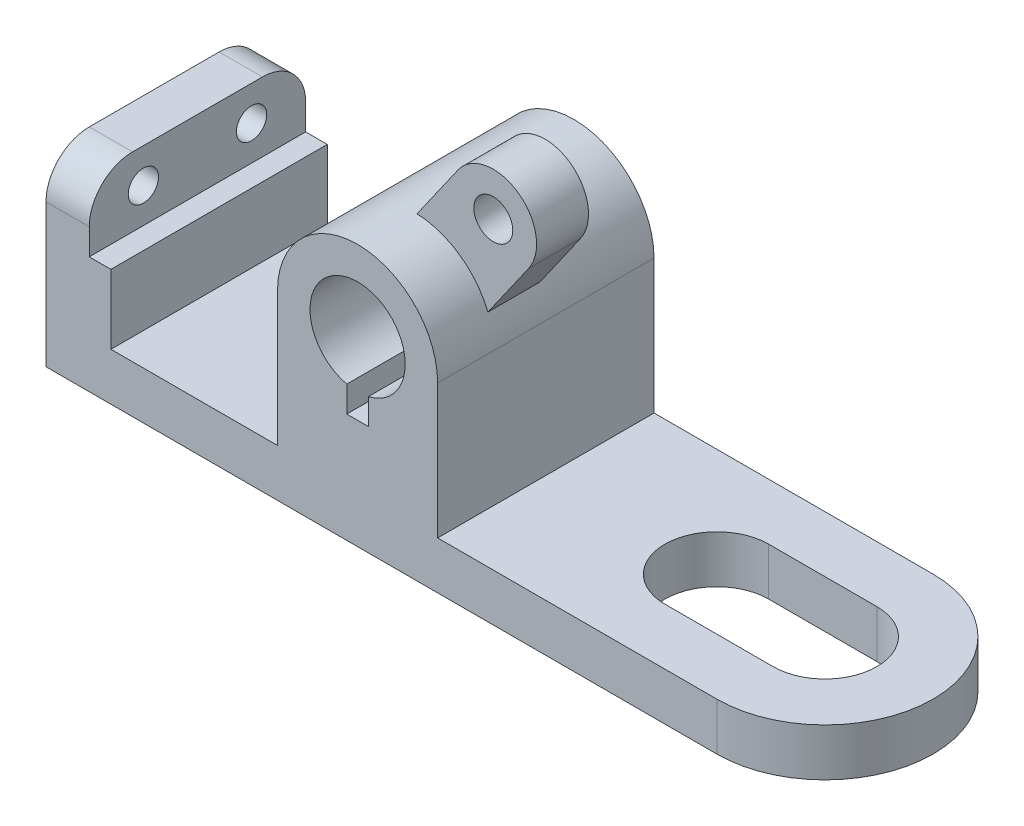
ISO-10303-21;
HEADER;
FILE_DESCRIPTION(('STEP AP214'),'2;1');
FILE_NAME('part.step','',(''),(''),'','','');
FILE_SCHEMA(('AUTOMOTIVE_DESIGN { 1 0 10303 214 1 1 1 1 }'));
ENDSEC;
DATA;
#1=APPLICATION_CONTEXT('core data for automotive mechanical design processes');
#2=APPLICATION_PROTOCOL_DEFINITION('international standard','automotive_design',2000,#1);
#3=PRODUCT_CONTEXT('',#1,'mechanical');
#4=PRODUCT('Part','Part','',(#3));
#5=PRODUCT_RELATED_PRODUCT_CATEGORY('part','',(#4));
#6=PRODUCT_DEFINITION_FORMATION('','',#4);
#7=PRODUCT_DEFINITION_CONTEXT('part definition',#1,'design');
#8=PRODUCT_DEFINITION('design','',#6,#7);
#9=PRODUCT_DEFINITION_SHAPE('','',#8);
#10=(LENGTH_UNIT() NAMED_UNIT(*) SI_UNIT(.MILLI.,.METRE.));
#11=(NAMED_UNIT(*) PLANE_ANGLE_UNIT() SI_UNIT($,.RADIAN.));
#12=(NAMED_UNIT(*) SI_UNIT($,.STERADIAN.) SOLID_ANGLE_UNIT());
#13=UNCERTAINTY_MEASURE_WITH_UNIT(LENGTH_MEASURE(1.E-05),#10,'distance_accuracy_value','');
#14=(GEOMETRIC_REPRESENTATION_CONTEXT(3) GLOBAL_UNCERTAINTY_ASSIGNED_CONTEXT((#13)) GLOBAL_UNIT_ASSIGNED_CONTEXT((#10,
#11,#12)) REPRESENTATION_CONTEXT('',''));
#15=CARTESIAN_POINT('',(0.,0.,0.));
#16=DIRECTION('',(0.,0.,1.));
#17=DIRECTION('',(1.,0.,0.));
#18=AXIS2_PLACEMENT_3D('',#15,#16,#17);
#19=CARTESIAN_POINT('',(0.,0.,-25.));
#20=DIRECTION('',(1.,0.,0.));
#21=DIRECTION('',(0.,0.,-1.));
#22=AXIS2_PLACEMENT_3D('',#19,#20,#21);
#23=PLANE('',#22);
#24=CARTESIAN_POINT('',(0.,33.,15.));
#25=DIRECTION('',(1.,0.,0.));
#26=DIRECTION('',(0.,0.,-1.));
#27=AXIS2_PLACEMENT_3D('',#24,#25,#26);
#28=CIRCLE('',#27,10.);
#29=CARTESIAN_POINT('',(0.,43.,15.));
#30=VERTEX_POINT('',#29);
#31=CARTESIAN_POINT('',(0.,32.9999999999999,25.));
#32=VERTEX_POINT('',#31);
#33=EDGE_CURVE('E297',#30,#32,#28,.T.);
#34=ORIENTED_EDGE('',*,*,#33,.F.);
#35=DIRECTION('',(0.,0.,1.));
#36=VECTOR('',#35,1.);
#37=CARTESIAN_POINT('',(0.,43.,-25.));
#38=LINE('',#37,#36);
#39=CARTESIAN_POINT('',(0.,43.,-14.9999999999999));
#40=VERTEX_POINT('',#39);
#41=EDGE_CURVE('E482',#40,#30,#38,.T.);
#42=ORIENTED_EDGE('',*,*,#41,.F.);
#43=CARTESIAN_POINT('',(0.,33.,-15.));
#44=DIRECTION('',(1.,0.,0.));
#45=DIRECTION('',(0.,0.,-1.));
#46=AXIS2_PLACEMENT_3D('',#43,#44,#45);
#47=CIRCLE('',#46,10.);
#48=CARTESIAN_POINT('',(0.,33.,-25.));
#49=VERTEX_POINT('',#48);
#50=EDGE_CURVE('E301',#40,#49,#47,.F.);
#51=ORIENTED_EDGE('',*,*,#50,.T.);
#52=DIRECTION('',(0.,1.,0.));
#53=VECTOR('',#52,1.);
#54=CARTESIAN_POINT('',(0.,0.,-25.));
#55=LINE('',#54,#53);
#56=CARTESIAN_POINT('',(0.,0.,-25.));
#57=VERTEX_POINT('',#56);
#58=EDGE_CURVE('E460',#57,#49,#55,.T.);
#59=ORIENTED_EDGE('',*,*,#58,.F.);
#60=DIRECTION('',(0.,0.,1.));
#61=VECTOR('',#60,1.);
#62=CARTESIAN_POINT('',(0.,0.,-25.));
#63=LINE('',#62,#61);
#64=CARTESIAN_POINT('',(0.,0.,25.));
#65=VERTEX_POINT('',#64);
#66=EDGE_CURVE('E481',#57,#65,#63,.T.);
#67=ORIENTED_EDGE('',*,*,#66,.T.);
#68=DIRECTION('',(0.,1.,0.));
#69=VECTOR('',#68,1.);
#70=CARTESIAN_POINT('',(0.,0.,25.));
#71=LINE('',#70,#69);
#72=EDGE_CURVE('E406',#65,#32,#71,.T.);
#73=ORIENTED_EDGE('',*,*,#72,.T.);
#74=EDGE_LOOP('',(#34,#42,#51,#59,#67,#73));
#75=FACE_BOUND('',#74,.T.);
#76=CARTESIAN_POINT('',(0.,35.,-12.5));
#77=DIRECTION('',(1.,0.,0.));
#78=DIRECTION('',(0.,0.,-1.));
#79=AXIS2_PLACEMENT_3D('',#76,#77,#78);
#80=CIRCLE('',#79,3.50000000000001);
#81=CARTESIAN_POINT('',(0.,35.,-16.));
#82=VERTEX_POINT('',#81);
#83=EDGE_CURVE('E273',#82,#82,#80,.F.);
#84=ORIENTED_EDGE('',*,*,#83,.F.);
#85=EDGE_LOOP('',(#84));
#86=FACE_BOUND('',#85,.T.);
#87=CARTESIAN_POINT('',(0.,35.,12.5));
#88=DIRECTION('',(1.,0.,0.));
#89=DIRECTION('',(0.,0.,-1.));
#90=AXIS2_PLACEMENT_3D('',#87,#88,#89);
#91=CIRCLE('',#90,3.50000000000001);
#92=CARTESIAN_POINT('',(0.,35.,8.99999999999999));
#93=VERTEX_POINT('',#92);
#94=EDGE_CURVE('E281',#93,#93,#91,.T.);
#95=ORIENTED_EDGE('',*,*,#94,.T.);
#96=EDGE_LOOP('',(#95));
#97=FACE_BOUND('',#96,.T.);
#98=ADVANCED_FACE('F46',(#75,#86,#97),#23,.F.);
#99=CARTESIAN_POINT('',(10.,0.,-25.));
#100=DIRECTION('',(-1.,0.,0.));
#101=DIRECTION('',(0.,-1.,0.));
#102=AXIS2_PLACEMENT_3D('',#99,#100,#101);
#103=PLANE('',#102);
#104=DIRECTION('',(0.,0.,1.));
#105=VECTOR('',#104,1.);
#106=CARTESIAN_POINT('',(10.,43.,-25.));
#107=LINE('',#106,#105);
#108=CARTESIAN_POINT('',(10.,43.,-14.9999999999999));
#109=VERTEX_POINT('',#108);
#110=CARTESIAN_POINT('',(10.,43.,14.9999999999999));
#111=VERTEX_POINT('',#110);
#112=EDGE_CURVE('E488',#109,#111,#107,.T.);
#113=ORIENTED_EDGE('',*,*,#112,.T.);
#114=CARTESIAN_POINT('',(10.,33.,15.));
#115=DIRECTION('',(1.,0.,0.));
#116=DIRECTION('',(0.,1.,0.));
#117=AXIS2_PLACEMENT_3D('',#114,#115,#116);
#118=CIRCLE('',#117,10.);
#119=CARTESIAN_POINT('',(10.,32.9999999999999,25.));
#120=VERTEX_POINT('',#119);
#121=EDGE_CURVE('E288',#111,#120,#118,.T.);
#122=ORIENTED_EDGE('',*,*,#121,.T.);
#123=DIRECTION('',(0.,-1.,0.));
#124=VECTOR('',#123,1.);
#125=CARTESIAN_POINT('',(10.,0.,25.));
#126=LINE('',#125,#124);
#127=CARTESIAN_POINT('',(10.,27.,25.));
#128=VERTEX_POINT('',#127);
#129=EDGE_CURVE('E401',#120,#128,#126,.T.);
#130=ORIENTED_EDGE('',*,*,#129,.T.);
#131=DIRECTION('',(0.,0.,1.));
#132=VECTOR('',#131,1.);
#133=CARTESIAN_POINT('',(10.,27.,-25.));
#134=LINE('',#133,#132);
#135=CARTESIAN_POINT('',(10.,27.,-25.));
#136=VERTEX_POINT('',#135);
#137=EDGE_CURVE('E495',#136,#128,#134,.T.);
#138=ORIENTED_EDGE('',*,*,#137,.F.);
#139=DIRECTION('',(0.,-1.,0.));
#140=VECTOR('',#139,1.);
#141=CARTESIAN_POINT('',(10.,0.,-25.));
#142=LINE('',#141,#140);
#143=CARTESIAN_POINT('',(10.,32.9999999999999,-25.));
#144=VERTEX_POINT('',#143);
#145=EDGE_CURVE('E455',#144,#136,#142,.T.);
#146=ORIENTED_EDGE('',*,*,#145,.F.);
#147=CARTESIAN_POINT('',(10.,33.,-15.));
#148=DIRECTION('',(1.,0.,0.));
#149=DIRECTION('',(0.,1.,0.));
#150=AXIS2_PLACEMENT_3D('',#147,#148,#149);
#151=CIRCLE('',#150,10.);
#152=EDGE_CURVE('E284',#109,#144,#151,.F.);
#153=ORIENTED_EDGE('',*,*,#152,.F.);
#154=EDGE_LOOP('',(#113,#122,#130,#138,#146,#153));
#155=FACE_BOUND('',#154,.T.);
#156=CARTESIAN_POINT('',(10.,35.,-12.5));
#157=DIRECTION('',(1.,0.,0.));
#158=DIRECTION('',(0.,1.,0.));
#159=AXIS2_PLACEMENT_3D('',#156,#157,#158);
#160=CIRCLE('',#159,3.50000000000001);
#161=CARTESIAN_POINT('',(10.,38.5,-12.5));
#162=VERTEX_POINT('',#161);
#163=EDGE_CURVE('E262',#162,#162,#160,.F.);
#164=ORIENTED_EDGE('',*,*,#163,.T.);
#165=EDGE_LOOP('',(#164));
#166=FACE_BOUND('',#165,.T.);
#167=CARTESIAN_POINT('',(10.,35.,12.5));
#168=DIRECTION('',(1.,0.,0.));
#169=DIRECTION('',(0.,1.,0.));
#170=AXIS2_PLACEMENT_3D('',#167,#168,#169);
#171=CIRCLE('',#170,3.50000000000001);
#172=CARTESIAN_POINT('',(10.,38.5,12.5));
#173=VERTEX_POINT('',#172);
#174=EDGE_CURVE('E269',#173,#173,#171,.T.);
#175=ORIENTED_EDGE('',*,*,#174,.F.);
#176=EDGE_LOOP('',(#175));
#177=FACE_BOUND('',#176,.T.);
#178=ADVANCED_FACE('F542',(#155,#166,#177),#103,.F.);
#179=CARTESIAN_POINT('',(0.,43.,-25.));
#180=DIRECTION('',(0.,-1.,0.));
#181=DIRECTION('',(0.,0.,-1.));
#182=AXIS2_PLACEMENT_3D('',#179,#180,#181);
#183=PLANE('',#182);
#184=ORIENTED_EDGE('',*,*,#41,.T.);
#185=DIRECTION('',(1.,0.,0.));
#186=VECTOR('',#185,1.);
#187=CARTESIAN_POINT('',(-0.999999999999997,43.,14.9999999999999));
#188=LINE('',#187,#186);
#189=EDGE_CURVE('E286',#30,#111,#188,.T.);
#190=ORIENTED_EDGE('',*,*,#189,.T.);
#191=ORIENTED_EDGE('',*,*,#112,.F.);
#192=DIRECTION('',(1.,0.,0.));
#193=VECTOR('',#192,1.);
#194=CARTESIAN_POINT('',(-0.999999999999997,43.,-14.9999999999999));
#195=LINE('',#194,#193);
#196=EDGE_CURVE('E292',#40,#109,#195,.T.);
#197=ORIENTED_EDGE('',*,*,#196,.F.);
#198=EDGE_LOOP('',(#184,#190,#191,#197));
#199=FACE_BOUND('',#198,.T.);
#200=ADVANCED_FACE('F552',(#199),#183,.F.);
#201=CARTESIAN_POINT('',(72.,42.,-25.));
#202=DIRECTION('',(0.,0.,1.));
#203=DIRECTION('',(1.,0.,0.));
#204=AXIS2_PLACEMENT_3D('',#201,#202,#203);
#205=CYLINDRICAL_SURFACE('',#204,18.5);
#206=DIRECTION('',(0.,0.,1.));
#207=VECTOR('',#206,1.);
#208=CARTESIAN_POINT('',(53.5,42.,-25.));
#209=LINE('',#208,#207);
#210=CARTESIAN_POINT('',(53.5,42.,-25.));
#211=VERTEX_POINT('',#210);
#212=CARTESIAN_POINT('',(53.5,42.,25.));
#213=VERTEX_POINT('',#212);
#214=EDGE_CURVE('E504',#211,#213,#209,.T.);
#215=ORIENTED_EDGE('',*,*,#214,.T.);
#216=CARTESIAN_POINT('',(72.,42.,25.));
#217=DIRECTION('',(0.,0.,1.));
#218=DIRECTION('',(1.,0.,0.));
#219=AXIS2_PLACEMENT_3D('',#216,#217,#218);
#220=CIRCLE('',#219,18.5);
#221=CARTESIAN_POINT('',(90.5,42.,25.));
#222=VERTEX_POINT('',#221);
#223=EDGE_CURVE('E382',#213,#222,#220,.F.);
#224=ORIENTED_EDGE('',*,*,#223,.T.);
#225=DIRECTION('',(0.,0.,1.));
#226=VECTOR('',#225,1.);
#227=CARTESIAN_POINT('',(90.5,42.,-25.));
#228=LINE('',#227,#226);
#229=CARTESIAN_POINT('',(90.5,42.,-25.));
#230=VERTEX_POINT('',#229);
#231=EDGE_CURVE('E294',#230,#222,#228,.T.);
#232=ORIENTED_EDGE('',*,*,#231,.F.);
#233=CARTESIAN_POINT('',(72.,42.,-25.));
#234=DIRECTION('',(0.,0.,1.));
#235=DIRECTION('',(1.,0.,0.));
#236=AXIS2_PLACEMENT_3D('',#233,#234,#235);
#237=CIRCLE('',#236,18.5);
#238=EDGE_CURVE('E437',#211,#230,#237,.F.);
#239=ORIENTED_EDGE('',*,*,#238,.F.);
#240=EDGE_LOOP('',(#215,#224,#232,#239));
#241=FACE_BOUND('',#240,.T.);
#242=CARTESIAN_POINT('',(72.,42.,12.));
#243=DIRECTION('',(0.,0.,1.));
#244=DIRECTION('',(1.,0.,0.));
#245=AXIS2_PLACEMENT_3D('',#242,#243,#244);
#246=CIRCLE('',#245,18.5);
#247=CARTESIAN_POINT('',(72.7358425574411,60.4853600378964,12.));
#248=VERTEX_POINT('',#247);
#249=CARTESIAN_POINT('',(89.1188834432209,49.0138313108755,12.));
#250=VERTEX_POINT('',#249);
#251=EDGE_CURVE('E329',#248,#250,#246,.F.);
#252=ORIENTED_EDGE('',*,*,#251,.F.);
#253=DIRECTION('',(0.,0.,-1.));
#254=VECTOR('',#253,1.);
#255=CARTESIAN_POINT('',(72.7358425574411,60.4853600378964,12.));
#256=LINE('',#255,#254);
#257=CARTESIAN_POINT('',(72.7358425574411,60.4853600378964,0.));
#258=VERTEX_POINT('',#257);
#259=EDGE_CURVE('E363',#248,#258,#256,.T.);
#260=ORIENTED_EDGE('',*,*,#259,.T.);
#261=CARTESIAN_POINT('',(72.,42.,0.));
#262=DIRECTION('',(0.,0.,1.));
#263=DIRECTION('',(1.,0.,0.));
#264=AXIS2_PLACEMENT_3D('',#261,#262,#263);
#265=CIRCLE('',#264,18.5);
#266=CARTESIAN_POINT('',(89.1188834432209,49.0138313108755,0.));
#267=VERTEX_POINT('',#266);
#268=EDGE_CURVE('E349',#258,#267,#265,.F.);
#269=ORIENTED_EDGE('',*,*,#268,.T.);
#270=DIRECTION('',(0.,0.,-1.));
#271=VECTOR('',#270,1.);
#272=CARTESIAN_POINT('',(89.1188834432209,49.0138313108754,12.));
#273=LINE('',#272,#271);
#274=EDGE_CURVE('E359',#250,#267,#273,.T.);
#275=ORIENTED_EDGE('',*,*,#274,.F.);
#276=EDGE_LOOP('',(#252,#260,#269,#275));
#277=FACE_BOUND('',#276,.T.);
#278=ADVANCED_FACE('F559',(#241,#277),#205,.T.);
#279=CARTESIAN_POINT('',(90.5,0.,-25.));
#280=DIRECTION('',(-1.,0.,0.));
#281=DIRECTION('',(0.,0.,1.));
#282=AXIS2_PLACEMENT_3D('',#279,#280,#281);
#283=PLANE('',#282);
#284=ORIENTED_EDGE('',*,*,#231,.T.);
#285=DIRECTION('',(0.,-1.,0.));
#286=VECTOR('',#285,1.);
#287=CARTESIAN_POINT('',(90.5,0.,25.));
#288=LINE('',#287,#286);
#289=CARTESIAN_POINT('',(90.5,11.,25.));
#290=VERTEX_POINT('',#289);
#291=EDGE_CURVE('E423',#222,#290,#288,.T.);
#292=ORIENTED_EDGE('',*,*,#291,.T.);
#293=DIRECTION('',(0.,0.,1.));
#294=VECTOR('',#293,1.);
#295=CARTESIAN_POINT('',(90.5,11.,-25.));
#296=LINE('',#295,#294);
#297=CARTESIAN_POINT('',(90.5,11.,-25.));
#298=VERTEX_POINT('',#297);
#299=EDGE_CURVE('E476',#298,#290,#296,.T.);
#300=ORIENTED_EDGE('',*,*,#299,.F.);
#301=DIRECTION('',(0.,-1.,0.));
#302=VECTOR('',#301,1.);
#303=CARTESIAN_POINT('',(90.5,0.,-25.));
#304=LINE('',#303,#302);
#305=EDGE_CURVE('E471',#230,#298,#304,.T.);
#306=ORIENTED_EDGE('',*,*,#305,.F.);
#307=EDGE_LOOP('',(#284,#292,#300,#306));
#308=FACE_BOUND('',#307,.T.);
#309=ADVANCED_FACE('F579',(#308),#283,.F.);
#310=CARTESIAN_POINT('',(0.,11.,-25.));
#311=DIRECTION('',(0.,-1.,0.));
#312=DIRECTION('',(0.,0.,-1.));
#313=AXIS2_PLACEMENT_3D('',#310,#311,#312);
#314=PLANE('',#313);
#315=CARTESIAN_POINT('',(130.,11.,0.));
#316=DIRECTION('',(0.,1.,0.));
#317=DIRECTION('',(0.,0.,1.));
#318=AXIS2_PLACEMENT_3D('',#315,#316,#317);
#319=CIRCLE('',#318,12.);
#320=CARTESIAN_POINT('',(130.,11.,-12.));
#321=VERTEX_POINT('',#320);
#322=CARTESIAN_POINT('',(130.,11.,12.));
#323=VERTEX_POINT('',#322);
#324=EDGE_CURVE('E254',#321,#323,#319,.T.);
#325=ORIENTED_EDGE('',*,*,#324,.F.);
#326=DIRECTION('',(-1.,0.,0.));
#327=VECTOR('',#326,1.);
#328=CARTESIAN_POINT('',(0.,11.,-12.));
#329=LINE('',#328,#327);
#330=CARTESIAN_POINT('',(155.,11.,-12.));
#331=VERTEX_POINT('',#330);
#332=EDGE_CURVE('E63',#331,#321,#329,.T.);
#333=ORIENTED_EDGE('',*,*,#332,.F.);
#334=CARTESIAN_POINT('',(155.,11.,0.));
#335=DIRECTION('',(0.,1.,0.));
#336=DIRECTION('',(0.,0.,1.));
#337=AXIS2_PLACEMENT_3D('',#334,#335,#336);
#338=CIRCLE('',#337,12.);
#339=CARTESIAN_POINT('',(155.,11.,12.));
#340=VERTEX_POINT('',#339);
#341=EDGE_CURVE('E245',#340,#331,#338,.T.);
#342=ORIENTED_EDGE('',*,*,#341,.F.);
#343=DIRECTION('',(-1.,0.,0.));
#344=VECTOR('',#343,1.);
#345=CARTESIAN_POINT('',(0.,11.,12.));
#346=LINE('',#345,#344);
#347=EDGE_CURVE('E248',#340,#323,#346,.T.);
#348=ORIENTED_EDGE('',*,*,#347,.T.);
#349=EDGE_LOOP('',(#325,#333,#342,#348));
#350=FACE_BOUND('',#349,.T.);
#351=ORIENTED_EDGE('',*,*,#299,.T.);
#352=DIRECTION('',(1.,0.,0.));
#353=VECTOR('',#352,1.);
#354=CARTESIAN_POINT('',(0.,11.,25.));
#355=LINE('',#354,#353);
#356=CARTESIAN_POINT('',(155.,11.,25.));
#357=VERTEX_POINT('',#356);
#358=EDGE_CURVE('E417',#290,#357,#355,.T.);
#359=ORIENTED_EDGE('',*,*,#358,.T.);
#360=CARTESIAN_POINT('',(155.,11.,0.));
#361=DIRECTION('',(0.,1.,0.));
#362=DIRECTION('',(0.,0.,-1.));
#363=AXIS2_PLACEMENT_3D('',#360,#361,#362);
#364=CIRCLE('',#363,25.);
#365=CARTESIAN_POINT('',(155.,11.,-25.));
#366=VERTEX_POINT('',#365);
#367=EDGE_CURVE('E310',#357,#366,#364,.T.);
#368=ORIENTED_EDGE('',*,*,#367,.T.);
#369=DIRECTION('',(1.,0.,0.));
#370=VECTOR('',#369,1.);
#371=CARTESIAN_POINT('',(0.,11.,-25.));
#372=LINE('',#371,#370);
#373=EDGE_CURVE('E470',#298,#366,#372,.T.);
#374=ORIENTED_EDGE('',*,*,#373,.F.);
#375=EDGE_LOOP('',(#351,#359,#368,#374));
#376=FACE_BOUND('',#375,.T.);
#377=ADVANCED_FACE('F624',(#350,#376),#314,.F.);
#378=CARTESIAN_POINT('',(0.,0.,-25.));
#379=DIRECTION('',(0.,-1.,0.));
#380=DIRECTION('',(0.,0.,-1.));
#381=AXIS2_PLACEMENT_3D('',#378,#379,#380);
#382=PLANE('',#381);
#383=DIRECTION('',(-1.,0.,0.));
#384=VECTOR('',#383,1.);
#385=CARTESIAN_POINT('',(0.,0.,-12.));
#386=LINE('',#385,#384);
#387=CARTESIAN_POINT('',(155.,0.,-12.));
#388=VERTEX_POINT('',#387);
#389=CARTESIAN_POINT('',(130.,0.,-12.));
#390=VERTEX_POINT('',#389);
#391=EDGE_CURVE('E221',#388,#390,#386,.T.);
#392=ORIENTED_EDGE('',*,*,#391,.T.);
#393=CARTESIAN_POINT('',(130.,0.,0.));
#394=DIRECTION('',(0.,1.,0.));
#395=DIRECTION('',(0.,0.,1.));
#396=AXIS2_PLACEMENT_3D('',#393,#394,#395);
#397=CIRCLE('',#396,12.);
#398=CARTESIAN_POINT('',(130.,0.,12.));
#399=VERTEX_POINT('',#398);
#400=EDGE_CURVE('E233',#390,#399,#397,.T.);
#401=ORIENTED_EDGE('',*,*,#400,.T.);
#402=DIRECTION('',(-1.,0.,0.));
#403=VECTOR('',#402,1.);
#404=CARTESIAN_POINT('',(0.,0.,12.));
#405=LINE('',#404,#403);
#406=CARTESIAN_POINT('',(155.,0.,12.));
#407=VERTEX_POINT('',#406);
#408=EDGE_CURVE('E237',#407,#399,#405,.T.);
#409=ORIENTED_EDGE('',*,*,#408,.F.);
#410=CARTESIAN_POINT('',(155.,0.,0.));
#411=DIRECTION('',(0.,1.,0.));
#412=DIRECTION('',(0.,0.,1.));
#413=AXIS2_PLACEMENT_3D('',#410,#411,#412);
#414=CIRCLE('',#413,12.);
#415=EDGE_CURVE('E227',#407,#388,#414,.T.);
#416=ORIENTED_EDGE('',*,*,#415,.T.);
#417=EDGE_LOOP('',(#392,#401,#409,#416));
#418=FACE_BOUND('',#417,.T.);
#419=DIRECTION('',(1.,0.,0.));
#420=VECTOR('',#419,1.);
#421=CARTESIAN_POINT('',(0.,0.,-25.));
#422=LINE('',#421,#420);
#423=CARTESIAN_POINT('',(155.,0.,-25.));
#424=VERTEX_POINT('',#423);
#425=EDGE_CURVE('E461',#57,#424,#422,.T.);
#426=ORIENTED_EDGE('',*,*,#425,.T.);
#427=CARTESIAN_POINT('',(155.,0.,0.));
#428=DIRECTION('',(0.,1.,0.));
#429=DIRECTION('',(0.,0.,-1.));
#430=AXIS2_PLACEMENT_3D('',#427,#428,#429);
#431=CIRCLE('',#430,25.);
#432=CARTESIAN_POINT('',(155.,0.,25.));
#433=VERTEX_POINT('',#432);
#434=EDGE_CURVE('E309',#433,#424,#431,.T.);
#435=ORIENTED_EDGE('',*,*,#434,.F.);
#436=DIRECTION('',(1.,0.,0.));
#437=VECTOR('',#436,1.);
#438=CARTESIAN_POINT('',(0.,0.,25.));
#439=LINE('',#438,#437);
#440=EDGE_CURVE('E409',#65,#433,#439,.T.);
#441=ORIENTED_EDGE('',*,*,#440,.F.);
#442=ORIENTED_EDGE('',*,*,#66,.F.);
#443=EDGE_LOOP('',(#426,#435,#441,#442));
#444=FACE_BOUND('',#443,.T.);
#445=ADVANCED_FACE('F236',(#418,#444),#382,.T.);
#446=CARTESIAN_POINT('',(0.,27.,-25.));
#447=DIRECTION('',(0.,-1.,0.));
#448=DIRECTION('',(1.,0.,0.));
#449=AXIS2_PLACEMENT_3D('',#446,#447,#448);
#450=PLANE('',#449);
#451=ORIENTED_EDGE('',*,*,#137,.T.);
#452=DIRECTION('',(1.,0.,0.));
#453=VECTOR('',#452,1.);
#454=CARTESIAN_POINT('',(0.,27.,25.));
#455=LINE('',#454,#453);
#456=CARTESIAN_POINT('',(15.,27.,25.));
#457=VERTEX_POINT('',#456);
#458=EDGE_CURVE('E400',#128,#457,#455,.T.);
#459=ORIENTED_EDGE('',*,*,#458,.T.);
#460=DIRECTION('',(0.,0.,1.));
#461=VECTOR('',#460,1.);
#462=CARTESIAN_POINT('',(15.,27.,-25.));
#463=LINE('',#462,#461);
#464=CARTESIAN_POINT('',(15.,27.,-25.));
#465=VERTEX_POINT('',#464);
#466=EDGE_CURVE('E497',#465,#457,#463,.T.);
#467=ORIENTED_EDGE('',*,*,#466,.F.);
#468=DIRECTION('',(1.,0.,0.));
#469=VECTOR('',#468,1.);
#470=CARTESIAN_POINT('',(0.,27.,-25.));
#471=LINE('',#470,#469);
#472=EDGE_CURVE('E453',#136,#465,#471,.T.);
#473=ORIENTED_EDGE('',*,*,#472,.F.);
#474=EDGE_LOOP('',(#451,#459,#467,#473));
#475=FACE_BOUND('',#474,.T.);
#476=ADVANCED_FACE('F562',(#475),#450,.F.);
#477=CARTESIAN_POINT('',(15.,0.,-25.));
#478=DIRECTION('',(-1.,0.,0.));
#479=DIRECTION('',(0.,0.,1.));
#480=AXIS2_PLACEMENT_3D('',#477,#478,#479);
#481=PLANE('',#480);
#482=ORIENTED_EDGE('',*,*,#466,.T.);
#483=DIRECTION('',(0.,-1.,0.));
#484=VECTOR('',#483,1.);
#485=CARTESIAN_POINT('',(15.,0.,25.));
#486=LINE('',#485,#484);
#487=CARTESIAN_POINT('',(15.,11.,25.));
#488=VERTEX_POINT('',#487);
#489=EDGE_CURVE('E394',#457,#488,#486,.T.);
#490=ORIENTED_EDGE('',*,*,#489,.T.);
#491=DIRECTION('',(0.,0.,1.));
#492=VECTOR('',#491,1.);
#493=CARTESIAN_POINT('',(15.,11.,-25.));
#494=LINE('',#493,#492);
#495=CARTESIAN_POINT('',(15.,11.,-25.));
#496=VERTEX_POINT('',#495);
#497=EDGE_CURVE('E496',#496,#488,#494,.T.);
#498=ORIENTED_EDGE('',*,*,#497,.F.);
#499=DIRECTION('',(0.,-1.,0.));
#500=VECTOR('',#499,1.);
#501=CARTESIAN_POINT('',(15.,0.,-25.));
#502=LINE('',#501,#500);
#503=EDGE_CURVE('E447',#465,#496,#502,.T.);
#504=ORIENTED_EDGE('',*,*,#503,.F.);
#505=EDGE_LOOP('',(#482,#490,#498,#504));
#506=FACE_BOUND('',#505,.T.);
#507=ADVANCED_FACE('F567',(#506),#481,.F.);
#508=CARTESIAN_POINT('',(0.,11.,-25.));
#509=DIRECTION('',(0.,-1.,0.));
#510=DIRECTION('',(0.,0.,-1.));
#511=AXIS2_PLACEMENT_3D('',#508,#509,#510);
#512=PLANE('',#511);
#513=ORIENTED_EDGE('',*,*,#497,.T.);
#514=DIRECTION('',(1.,0.,0.));
#515=VECTOR('',#514,1.);
#516=CARTESIAN_POINT('',(0.,11.,25.));
#517=LINE('',#516,#515);
#518=CARTESIAN_POINT('',(53.5,11.,25.));
#519=VERTEX_POINT('',#518);
#520=EDGE_CURVE('E391',#488,#519,#517,.T.);
#521=ORIENTED_EDGE('',*,*,#520,.T.);
#522=DIRECTION('',(0.,0.,1.));
#523=VECTOR('',#522,1.);
#524=CARTESIAN_POINT('',(53.5,11.,-25.));
#525=LINE('',#524,#523);
#526=CARTESIAN_POINT('',(53.5,11.,-25.));
#527=VERTEX_POINT('',#526);
#528=EDGE_CURVE('E505',#527,#519,#525,.T.);
#529=ORIENTED_EDGE('',*,*,#528,.F.);
#530=DIRECTION('',(1.,0.,0.));
#531=VECTOR('',#530,1.);
#532=CARTESIAN_POINT('',(0.,11.,-25.));
#533=LINE('',#532,#531);
#534=EDGE_CURVE('E443',#496,#527,#533,.T.);
#535=ORIENTED_EDGE('',*,*,#534,.F.);
#536=EDGE_LOOP('',(#513,#521,#529,#535));
#537=FACE_BOUND('',#536,.T.);
#538=ADVANCED_FACE('F568',(#537),#512,.F.);
#539=CARTESIAN_POINT('',(72.,42.,-25.));
#540=DIRECTION('',(0.,0.,1.));
#541=DIRECTION('',(1.,0.,0.));
#542=AXIS2_PLACEMENT_3D('',#539,#540,#541);
#543=CYLINDRICAL_SURFACE('',#542,11.);
#544=DIRECTION('',(0.,0.,1.));
#545=VECTOR('',#544,1.);
#546=CARTESIAN_POINT('',(74.5,31.2878573571857,-25.));
#547=LINE('',#546,#545);
#548=CARTESIAN_POINT('',(74.5,31.2878573571857,-25.));
#549=VERTEX_POINT('',#548);
#550=CARTESIAN_POINT('',(74.5,31.2878573571857,25.));
#551=VERTEX_POINT('',#550);
#552=EDGE_CURVE('E49',#549,#551,#547,.T.);
#553=ORIENTED_EDGE('',*,*,#552,.T.);
#554=CARTESIAN_POINT('',(72.,42.,25.));
#555=DIRECTION('',(0.,0.,1.));
#556=DIRECTION('',(1.,0.,0.));
#557=AXIS2_PLACEMENT_3D('',#554,#555,#556);
#558=CIRCLE('',#557,11.);
#559=CARTESIAN_POINT('',(69.5,31.2878573571857,25.));
#560=VERTEX_POINT('',#559);
#561=EDGE_CURVE('E370',#551,#560,#558,.T.);
#562=ORIENTED_EDGE('',*,*,#561,.T.);
#563=DIRECTION('',(0.,0.,1.));
#564=VECTOR('',#563,1.);
#565=CARTESIAN_POINT('',(69.5,31.2878573571857,-25.));
#566=LINE('',#565,#564);
#567=CARTESIAN_POINT('',(69.5,31.2878573571857,-25.));
#568=VERTEX_POINT('',#567);
#569=EDGE_CURVE('E507',#568,#560,#566,.T.);
#570=ORIENTED_EDGE('',*,*,#569,.F.);
#571=CARTESIAN_POINT('',(72.,42.,-25.));
#572=DIRECTION('',(0.,0.,1.));
#573=DIRECTION('',(1.,0.,0.));
#574=AXIS2_PLACEMENT_3D('',#571,#572,#573);
#575=CIRCLE('',#574,11.);
#576=EDGE_CURVE('E422',#549,#568,#575,.T.);
#577=ORIENTED_EDGE('',*,*,#576,.F.);
#578=EDGE_LOOP('',(#553,#562,#570,#577));
#579=FACE_BOUND('',#578,.T.);
#580=ADVANCED_FACE('F48',(#579),#543,.F.);
#581=CARTESIAN_POINT('',(69.5,0.,-25.));
#582=DIRECTION('',(-1.,0.,0.));
#583=DIRECTION('',(0.,0.,1.));
#584=AXIS2_PLACEMENT_3D('',#581,#582,#583);
#585=PLANE('',#584);
#586=ORIENTED_EDGE('',*,*,#569,.T.);
#587=DIRECTION('',(0.,-1.,0.));
#588=VECTOR('',#587,1.);
#589=CARTESIAN_POINT('',(69.5,0.,25.));
#590=LINE('',#589,#588);
#591=CARTESIAN_POINT('',(69.5,25.2878573571857,25.));
#592=VERTEX_POINT('',#591);
#593=EDGE_CURVE('E377',#560,#592,#590,.T.);
#594=ORIENTED_EDGE('',*,*,#593,.T.);
#595=DIRECTION('',(0.,0.,1.));
#596=VECTOR('',#595,1.);
#597=CARTESIAN_POINT('',(69.5,25.2878573571857,-25.));
#598=LINE('',#597,#596);
#599=CARTESIAN_POINT('',(69.5,25.2878573571857,-25.));
#600=VERTEX_POINT('',#599);
#601=EDGE_CURVE('E512',#600,#592,#598,.T.);
#602=ORIENTED_EDGE('',*,*,#601,.F.);
#603=DIRECTION('',(0.,-1.,0.));
#604=VECTOR('',#603,1.);
#605=CARTESIAN_POINT('',(69.5,0.,-25.));
#606=LINE('',#605,#604);
#607=EDGE_CURVE('E434',#568,#600,#606,.T.);
#608=ORIENTED_EDGE('',*,*,#607,.F.);
#609=EDGE_LOOP('',(#586,#594,#602,#608));
#610=FACE_BOUND('',#609,.T.);
#611=ADVANCED_FACE('F539',(#610),#585,.F.);
#612=CARTESIAN_POINT('',(0.,25.2878573571857,-25.));
#613=DIRECTION('',(0.,-1.,0.));
#614=DIRECTION('',(0.,0.,-1.));
#615=AXIS2_PLACEMENT_3D('',#612,#613,#614);
#616=PLANE('',#615);
#617=ORIENTED_EDGE('',*,*,#601,.T.);
#618=DIRECTION('',(1.,0.,0.));
#619=VECTOR('',#618,1.);
#620=CARTESIAN_POINT('',(0.,25.2878573571857,25.));
#621=LINE('',#620,#619);
#622=CARTESIAN_POINT('',(74.5,25.2878573571857,25.));
#623=VERTEX_POINT('',#622);
#624=EDGE_CURVE('E374',#592,#623,#621,.T.);
#625=ORIENTED_EDGE('',*,*,#624,.T.);
#626=DIRECTION('',(0.,0.,1.));
#627=VECTOR('',#626,1.);
#628=CARTESIAN_POINT('',(74.5,25.2878573571857,-25.));
#629=LINE('',#628,#627);
#630=CARTESIAN_POINT('',(74.5,25.2878573571857,-25.));
#631=VERTEX_POINT('',#630);
#632=EDGE_CURVE('E511',#631,#623,#629,.T.);
#633=ORIENTED_EDGE('',*,*,#632,.F.);
#634=DIRECTION('',(1.,0.,0.));
#635=VECTOR('',#634,1.);
#636=CARTESIAN_POINT('',(0.,25.2878573571857,-25.));
#637=LINE('',#636,#635);
#638=EDGE_CURVE('E435',#600,#631,#637,.T.);
#639=ORIENTED_EDGE('',*,*,#638,.F.);
#640=EDGE_LOOP('',(#617,#625,#633,#639));
#641=FACE_BOUND('',#640,.T.);
#642=ADVANCED_FACE('F535',(#641),#616,.F.);
#643=CARTESIAN_POINT('',(74.5,0.,-25.));
#644=DIRECTION('',(1.,0.,0.));
#645=DIRECTION('',(0.,0.,-1.));
#646=AXIS2_PLACEMENT_3D('',#643,#644,#645);
#647=PLANE('',#646);
#648=ORIENTED_EDGE('',*,*,#632,.T.);
#649=DIRECTION('',(0.,1.,0.));
#650=VECTOR('',#649,1.);
#651=CARTESIAN_POINT('',(74.5,0.,25.));
#652=LINE('',#651,#650);
#653=EDGE_CURVE('E371',#623,#551,#652,.T.);
#654=ORIENTED_EDGE('',*,*,#653,.T.);
#655=ORIENTED_EDGE('',*,*,#552,.F.);
#656=DIRECTION('',(0.,1.,0.));
#657=VECTOR('',#656,1.);
#658=CARTESIAN_POINT('',(74.5,0.,-25.));
#659=LINE('',#658,#657);
#660=EDGE_CURVE('E427',#631,#549,#659,.T.);
#661=ORIENTED_EDGE('',*,*,#660,.F.);
#662=EDGE_LOOP('',(#648,#654,#655,#661));
#663=FACE_BOUND('',#662,.T.);
#664=ADVANCED_FACE('F530',(#663),#647,.F.);
#665=CARTESIAN_POINT('',(53.5,0.,-25.));
#666=DIRECTION('',(1.,0.,0.));
#667=DIRECTION('',(0.,0.,-1.));
#668=AXIS2_PLACEMENT_3D('',#665,#666,#667);
#669=PLANE('',#668);
#670=ORIENTED_EDGE('',*,*,#528,.T.);
#671=DIRECTION('',(0.,1.,0.));
#672=VECTOR('',#671,1.);
#673=CARTESIAN_POINT('',(53.5,0.,25.));
#674=LINE('',#673,#672);
#675=EDGE_CURVE('E390',#519,#213,#674,.T.);
#676=ORIENTED_EDGE('',*,*,#675,.T.);
#677=ORIENTED_EDGE('',*,*,#214,.F.);
#678=DIRECTION('',(0.,1.,0.));
#679=VECTOR('',#678,1.);
#680=CARTESIAN_POINT('',(53.5,0.,-25.));
#681=LINE('',#680,#679);
#682=EDGE_CURVE('E445',#527,#211,#681,.T.);
#683=ORIENTED_EDGE('',*,*,#682,.F.);
#684=EDGE_LOOP('',(#670,#676,#677,#683));
#685=FACE_BOUND('',#684,.T.);
#686=ADVANCED_FACE('F533',(#685),#669,.F.);
#687=CARTESIAN_POINT('',(0.,0.,-25.));
#688=DIRECTION('',(0.,0.,1.));
#689=DIRECTION('',(1.,0.,0.));
#690=AXIS2_PLACEMENT_3D('',#687,#688,#689);
#691=PLANE('',#690);
#692=ORIENTED_EDGE('',*,*,#576,.T.);
#693=ORIENTED_EDGE('',*,*,#607,.T.);
#694=ORIENTED_EDGE('',*,*,#638,.T.);
#695=ORIENTED_EDGE('',*,*,#660,.T.);
#696=EDGE_LOOP('',(#692,#693,#694,#695));
#697=FACE_BOUND('',#696,.T.);
#698=ORIENTED_EDGE('',*,*,#58,.T.);
#699=DIRECTION('',(1.,0.,0.));
#700=VECTOR('',#699,1.);
#701=CARTESIAN_POINT('',(-0.999999999999996,32.9999999999999,-25.));
#702=LINE('',#701,#700);
#703=EDGE_CURVE('E12',#49,#144,#702,.T.);
#704=ORIENTED_EDGE('',*,*,#703,.T.);
#705=ORIENTED_EDGE('',*,*,#145,.T.);
#706=ORIENTED_EDGE('',*,*,#472,.T.);
#707=ORIENTED_EDGE('',*,*,#503,.T.);
#708=ORIENTED_EDGE('',*,*,#534,.T.);
#709=ORIENTED_EDGE('',*,*,#682,.T.);
#710=ORIENTED_EDGE('',*,*,#238,.T.);
#711=ORIENTED_EDGE('',*,*,#305,.T.);
#712=ORIENTED_EDGE('',*,*,#373,.T.);
#713=DIRECTION('',(0.,-1.,0.));
#714=VECTOR('',#713,1.);
#715=CARTESIAN_POINT('',(155.,0.,-25.));
#716=LINE('',#715,#714);
#717=EDGE_CURVE('E464',#366,#424,#716,.T.);
#718=ORIENTED_EDGE('',*,*,#717,.T.);
#719=ORIENTED_EDGE('',*,*,#425,.F.);
#720=EDGE_LOOP('',(#698,#704,#705,#706,#707,#708,#709,#710,#711,#712,#718,#719));
#721=FACE_BOUND('',#720,.T.);
#722=ADVANCED_FACE('F540',(#697,#721),#691,.F.);
#723=CARTESIAN_POINT('',(0.,0.,25.));
#724=DIRECTION('',(0.,0.,1.));
#725=DIRECTION('',(1.,0.,0.));
#726=AXIS2_PLACEMENT_3D('',#723,#724,#725);
#727=PLANE('',#726);
#728=DIRECTION('',(1.,0.,0.));
#729=VECTOR('',#728,1.);
#730=CARTESIAN_POINT('',(-0.999999999999996,32.9999999999999,25.));
#731=LINE('',#730,#729);
#732=EDGE_CURVE('E57',#32,#120,#731,.T.);
#733=ORIENTED_EDGE('',*,*,#732,.F.);
#734=ORIENTED_EDGE('',*,*,#72,.F.);
#735=ORIENTED_EDGE('',*,*,#440,.T.);
#736=DIRECTION('',(0.,-1.,0.));
#737=VECTOR('',#736,1.);
#738=CARTESIAN_POINT('',(155.,0.,25.));
#739=LINE('',#738,#737);
#740=EDGE_CURVE('E415',#357,#433,#739,.T.);
#741=ORIENTED_EDGE('',*,*,#740,.F.);
#742=ORIENTED_EDGE('',*,*,#358,.F.);
#743=ORIENTED_EDGE('',*,*,#291,.F.);
#744=ORIENTED_EDGE('',*,*,#223,.F.);
#745=ORIENTED_EDGE('',*,*,#675,.F.);
#746=ORIENTED_EDGE('',*,*,#520,.F.);
#747=ORIENTED_EDGE('',*,*,#489,.F.);
#748=ORIENTED_EDGE('',*,*,#458,.F.);
#749=ORIENTED_EDGE('',*,*,#129,.F.);
#750=EDGE_LOOP('',(#733,#734,#735,#741,#742,#743,#744,#745,#746,#747,#748,#749));
#751=FACE_BOUND('',#750,.T.);
#752=ORIENTED_EDGE('',*,*,#561,.F.);
#753=ORIENTED_EDGE('',*,*,#653,.F.);
#754=ORIENTED_EDGE('',*,*,#624,.F.);
#755=ORIENTED_EDGE('',*,*,#593,.F.);
#756=EDGE_LOOP('',(#752,#753,#754,#755));
#757=FACE_BOUND('',#756,.T.);
#758=ADVANCED_FACE('F527',(#751,#757),#727,.T.);
#759=CARTESIAN_POINT('',(90.3544459632336,68.2128654172477,12.));
#760=DIRECTION('',(0.,0.,-1.));
#761=DIRECTION('',(-1.,0.,0.));
#762=AXIS2_PLACEMENT_3D('',#759,#760,#761);
#763=CYLINDRICAL_SURFACE('',#762,10.);
#764=CARTESIAN_POINT('',(90.3544459632336,68.2128654172477,0.));
#765=DIRECTION('',(0.,0.,1.));
#766=DIRECTION('',(1.,0.,0.));
#767=AXIS2_PLACEMENT_3D('',#764,#765,#766);
#768=CIRCLE('',#767,10.);
#769=CARTESIAN_POINT('',(82.1629255203437,73.9486297807582,0.));
#770=VERTEX_POINT('',#769);
#771=CARTESIAN_POINT('',(98.5459664061235,62.4771010537372,0.));
#772=VERTEX_POINT('',#771);
#773=EDGE_CURVE('E343',#770,#772,#768,.F.);
#774=ORIENTED_EDGE('',*,*,#773,.F.);
#775=DIRECTION('',(0.,0.,-1.));
#776=VECTOR('',#775,1.);
#777=CARTESIAN_POINT('',(82.1629255203437,73.9486297807582,12.));
#778=LINE('',#777,#776);
#779=CARTESIAN_POINT('',(82.1629255203437,73.9486297807582,12.));
#780=VERTEX_POINT('',#779);
#781=EDGE_CURVE('E365',#780,#770,#778,.T.);
#782=ORIENTED_EDGE('',*,*,#781,.F.);
#783=CARTESIAN_POINT('',(90.3544459632336,68.2128654172477,12.));
#784=DIRECTION('',(0.,0.,1.));
#785=DIRECTION('',(1.,0.,0.));
#786=AXIS2_PLACEMENT_3D('',#783,#784,#785);
#787=CIRCLE('',#786,10.);
#788=CARTESIAN_POINT('',(98.5459664061235,62.4771010537372,12.));
#789=VERTEX_POINT('',#788);
#790=EDGE_CURVE('E321',#780,#789,#787,.F.);
#791=ORIENTED_EDGE('',*,*,#790,.T.);
#792=DIRECTION('',(0.,0.,-1.));
#793=VECTOR('',#792,1.);
#794=CARTESIAN_POINT('',(98.5459664061235,62.4771010537372,12.));
#795=LINE('',#794,#793);
#796=EDGE_CURVE('E340',#789,#772,#795,.T.);
#797=ORIENTED_EDGE('',*,*,#796,.T.);
#798=EDGE_LOOP('',(#774,#782,#791,#797));
#799=FACE_BOUND('',#798,.T.);
#800=ADVANCED_FACE('F650',(#799),#763,.T.);
#801=CARTESIAN_POINT('',(20.3876596803297,-14.2755929946212,12.));
#802=DIRECTION('',(-0.819152044288989,0.57357643635105,0.));
#803=DIRECTION('',(-0.57357643635105,-0.819152044288989,0.));
#804=AXIS2_PLACEMENT_3D('',#801,#802,#803);
#805=PLANE('',#804);
#806=DIRECTION('',(0.57357643635105,0.819152044288989,0.));
#807=VECTOR('',#806,1.);
#808=CARTESIAN_POINT('',(20.3876596803297,-14.2755929946212,0.));
#809=LINE('',#808,#807);
#810=EDGE_CURVE('E341',#258,#770,#809,.T.);
#811=ORIENTED_EDGE('',*,*,#810,.F.);
#812=ORIENTED_EDGE('',*,*,#259,.F.);
#813=DIRECTION('',(0.57357643635105,0.819152044288989,0.));
#814=VECTOR('',#813,1.);
#815=CARTESIAN_POINT('',(20.3876596803297,-14.2755929946212,12.));
#816=LINE('',#815,#814);
#817=EDGE_CURVE('E326',#248,#780,#816,.T.);
#818=ORIENTED_EDGE('',*,*,#817,.T.);
#819=ORIENTED_EDGE('',*,*,#781,.T.);
#820=EDGE_LOOP('',(#811,#812,#818,#819));
#821=FACE_BOUND('',#820,.T.);
#822=ADVANCED_FACE('F655',(#821),#805,.T.);
#823=CARTESIAN_POINT('',(90.3544459632336,68.2128654172477,12.));
#824=DIRECTION('',(0.,0.,-1.));
#825=DIRECTION('',(-1.,0.,0.));
#826=AXIS2_PLACEMENT_3D('',#823,#824,#825);
#827=CYLINDRICAL_SURFACE('',#826,4.50000000000001);
#828=CARTESIAN_POINT('',(90.3544459632336,68.2128654172477,12.));
#829=DIRECTION('',(0.,0.,1.));
#830=DIRECTION('',(1.,0.,0.));
#831=AXIS2_PLACEMENT_3D('',#828,#829,#830);
#832=CIRCLE('',#831,4.50000000000001);
#833=CARTESIAN_POINT('',(94.8544459632336,68.2128654172477,12.));
#834=VERTEX_POINT('',#833);
#835=EDGE_CURVE('E320',#834,#834,#832,.T.);
#836=ORIENTED_EDGE('',*,*,#835,.T.);
#837=EDGE_LOOP('',(#836));
#838=FACE_BOUND('',#837,.T.);
#839=CARTESIAN_POINT('',(90.3544459632336,68.2128654172477,0.));
#840=DIRECTION('',(0.,0.,1.));
#841=DIRECTION('',(1.,0.,0.));
#842=AXIS2_PLACEMENT_3D('',#839,#840,#841);
#843=CIRCLE('',#842,4.50000000000001);
#844=CARTESIAN_POINT('',(94.8544459632336,68.2128654172477,0.));
#845=VERTEX_POINT('',#844);
#846=EDGE_CURVE('E311',#845,#845,#843,.T.);
#847=ORIENTED_EDGE('',*,*,#846,.F.);
#848=EDGE_LOOP('',(#847));
#849=FACE_BOUND('',#848,.T.);
#850=ADVANCED_FACE('F648',(#838,#849),#827,.F.);
#851=CARTESIAN_POINT('',(36.7707005661095,-25.7471217216422,12.));
#852=DIRECTION('',(-0.819152044288989,0.57357643635105,0.));
#853=DIRECTION('',(-0.57357643635105,-0.819152044288989,0.));
#854=AXIS2_PLACEMENT_3D('',#851,#852,#853);
#855=PLANE('',#854);
#856=DIRECTION('',(0.57357643635105,0.819152044288989,0.));
#857=VECTOR('',#856,1.);
#858=CARTESIAN_POINT('',(36.7707005661095,-25.7471217216422,0.));
#859=LINE('',#858,#857);
#860=EDGE_CURVE('E325',#267,#772,#859,.T.);
#861=ORIENTED_EDGE('',*,*,#860,.T.);
#862=ORIENTED_EDGE('',*,*,#796,.F.);
#863=DIRECTION('',(0.57357643635105,0.819152044288989,0.));
#864=VECTOR('',#863,1.);
#865=CARTESIAN_POINT('',(36.7707005661095,-25.7471217216422,12.));
#866=LINE('',#865,#864);
#867=EDGE_CURVE('E331',#250,#789,#866,.T.);
#868=ORIENTED_EDGE('',*,*,#867,.F.);
#869=ORIENTED_EDGE('',*,*,#274,.T.);
#870=EDGE_LOOP('',(#861,#862,#868,#869));
#871=FACE_BOUND('',#870,.T.);
#872=ADVANCED_FACE('F651',(#871),#855,.F.);
#873=CARTESIAN_POINT('',(0.,0.,12.));
#874=DIRECTION('',(0.,0.,1.));
#875=DIRECTION('',(1.,0.,0.));
#876=AXIS2_PLACEMENT_3D('',#873,#874,#875);
#877=PLANE('',#876);
#878=ORIENTED_EDGE('',*,*,#835,.F.);
#879=EDGE_LOOP('',(#878));
#880=FACE_BOUND('',#879,.T.);
#881=ORIENTED_EDGE('',*,*,#790,.F.);
#882=ORIENTED_EDGE('',*,*,#817,.F.);
#883=ORIENTED_EDGE('',*,*,#251,.T.);
#884=ORIENTED_EDGE('',*,*,#867,.T.);
#885=EDGE_LOOP('',(#881,#882,#883,#884));
#886=FACE_BOUND('',#885,.T.);
#887=ADVANCED_FACE('F665',(#880,#886),#877,.T.);
#888=CARTESIAN_POINT('',(0.,0.,0.));
#889=DIRECTION('',(0.,0.,1.));
#890=DIRECTION('',(1.,0.,0.));
#891=AXIS2_PLACEMENT_3D('',#888,#889,#890);
#892=PLANE('',#891);
#893=ORIENTED_EDGE('',*,*,#846,.T.);
#894=EDGE_LOOP('',(#893));
#895=FACE_BOUND('',#894,.T.);
#896=ORIENTED_EDGE('',*,*,#773,.T.);
#897=ORIENTED_EDGE('',*,*,#860,.F.);
#898=ORIENTED_EDGE('',*,*,#268,.F.);
#899=ORIENTED_EDGE('',*,*,#810,.T.);
#900=EDGE_LOOP('',(#896,#897,#898,#899));
#901=FACE_BOUND('',#900,.T.);
#902=ADVANCED_FACE('F661',(#895,#901),#892,.F.);
#903=CARTESIAN_POINT('',(155.,0.,0.));
#904=DIRECTION('',(0.,1.,0.));
#905=DIRECTION('',(0.,0.,1.));
#906=AXIS2_PLACEMENT_3D('',#903,#904,#905);
#907=CYLINDRICAL_SURFACE('',#906,25.);
#908=ORIENTED_EDGE('',*,*,#367,.F.);
#909=ORIENTED_EDGE('',*,*,#740,.T.);
#910=ORIENTED_EDGE('',*,*,#434,.T.);
#911=ORIENTED_EDGE('',*,*,#717,.F.);
#912=EDGE_LOOP('',(#908,#909,#910,#911));
#913=FACE_BOUND('',#912,.T.);
#914=ADVANCED_FACE('F627',(#913),#907,.T.);
#915=CARTESIAN_POINT('',(-0.999999999999996,33.,-15.));
#916=DIRECTION('',(1.,0.,0.));
#917=DIRECTION('',(0.,1.,0.));
#918=AXIS2_PLACEMENT_3D('',#915,#916,#917);
#919=CYLINDRICAL_SURFACE('',#918,10.);
#920=ORIENTED_EDGE('',*,*,#196,.T.);
#921=ORIENTED_EDGE('',*,*,#152,.T.);
#922=ORIENTED_EDGE('',*,*,#703,.F.);
#923=ORIENTED_EDGE('',*,*,#50,.F.);
#924=EDGE_LOOP('',(#920,#921,#922,#923));
#925=FACE_BOUND('',#924,.T.);
#926=ADVANCED_FACE('F600',(#925),#919,.T.);
#927=CARTESIAN_POINT('',(-0.999999999999996,33.,15.));
#928=DIRECTION('',(1.,0.,0.));
#929=DIRECTION('',(0.,1.,0.));
#930=AXIS2_PLACEMENT_3D('',#927,#928,#929);
#931=CYLINDRICAL_SURFACE('',#930,10.);
#932=ORIENTED_EDGE('',*,*,#33,.T.);
#933=ORIENTED_EDGE('',*,*,#732,.T.);
#934=ORIENTED_EDGE('',*,*,#121,.F.);
#935=ORIENTED_EDGE('',*,*,#189,.F.);
#936=EDGE_LOOP('',(#932,#933,#934,#935));
#937=FACE_BOUND('',#936,.T.);
#938=ADVANCED_FACE('F671',(#937),#931,.T.);
#939=CARTESIAN_POINT('',(-0.999999999999997,35.,-12.5));
#940=DIRECTION('',(1.,0.,0.));
#941=DIRECTION('',(0.,1.,0.));
#942=AXIS2_PLACEMENT_3D('',#939,#940,#941);
#943=CYLINDRICAL_SURFACE('',#942,3.50000000000001);
#944=ORIENTED_EDGE('',*,*,#163,.F.);
#945=EDGE_LOOP('',(#944));
#946=FACE_BOUND('',#945,.T.);
#947=ORIENTED_EDGE('',*,*,#83,.T.);
#948=EDGE_LOOP('',(#947));
#949=FACE_BOUND('',#948,.T.);
#950=ADVANCED_FACE('F680',(#946,#949),#943,.F.);
#951=CARTESIAN_POINT('',(-0.999999999999997,35.,12.5));
#952=DIRECTION('',(1.,0.,0.));
#953=DIRECTION('',(0.,1.,0.));
#954=AXIS2_PLACEMENT_3D('',#951,#952,#953);
#955=CYLINDRICAL_SURFACE('',#954,3.50000000000001);
#956=ORIENTED_EDGE('',*,*,#174,.T.);
#957=EDGE_LOOP('',(#956));
#958=FACE_BOUND('',#957,.T.);
#959=ORIENTED_EDGE('',*,*,#94,.F.);
#960=EDGE_LOOP('',(#959));
#961=FACE_BOUND('',#960,.T.);
#962=ADVANCED_FACE('F681',(#958,#961),#955,.F.);
#963=CARTESIAN_POINT('',(0.,0.,-12.));
#964=DIRECTION('',(0.,0.,-1.));
#965=DIRECTION('',(-1.,0.,0.));
#966=AXIS2_PLACEMENT_3D('',#963,#964,#965);
#967=PLANE('',#966);
#968=ORIENTED_EDGE('',*,*,#332,.T.);
#969=DIRECTION('',(0.,1.,0.));
#970=VECTOR('',#969,1.);
#971=CARTESIAN_POINT('',(130.,0.,-12.));
#972=LINE('',#971,#970);
#973=EDGE_CURVE('E222',#390,#321,#972,.T.);
#974=ORIENTED_EDGE('',*,*,#973,.F.);
#975=ORIENTED_EDGE('',*,*,#391,.F.);
#976=DIRECTION('',(0.,1.,0.));
#977=VECTOR('',#976,1.);
#978=CARTESIAN_POINT('',(155.,0.,-12.));
#979=LINE('',#978,#977);
#980=EDGE_CURVE('E261',#388,#331,#979,.T.);
#981=ORIENTED_EDGE('',*,*,#980,.T.);
#982=EDGE_LOOP('',(#968,#974,#975,#981));
#983=FACE_BOUND('',#982,.T.);
#984=ADVANCED_FACE('F225',(#983),#967,.F.);
#985=CARTESIAN_POINT('',(155.,0.,0.));
#986=DIRECTION('',(0.,1.,0.));
#987=DIRECTION('',(0.,0.,1.));
#988=AXIS2_PLACEMENT_3D('',#985,#986,#987);
#989=CYLINDRICAL_SURFACE('',#988,12.);
#990=ORIENTED_EDGE('',*,*,#341,.T.);
#991=ORIENTED_EDGE('',*,*,#980,.F.);
#992=ORIENTED_EDGE('',*,*,#415,.F.);
#993=DIRECTION('',(0.,1.,0.));
#994=VECTOR('',#993,1.);
#995=CARTESIAN_POINT('',(155.,0.,12.));
#996=LINE('',#995,#994);
#997=EDGE_CURVE('E264',#407,#340,#996,.T.);
#998=ORIENTED_EDGE('',*,*,#997,.T.);
#999=EDGE_LOOP('',(#990,#991,#992,#998));
#1000=FACE_BOUND('',#999,.T.);
#1001=ADVANCED_FACE('F688',(#1000),#989,.F.);
#1002=CARTESIAN_POINT('',(0.,0.,12.));
#1003=DIRECTION('',(0.,0.,-1.));
#1004=DIRECTION('',(-1.,0.,0.));
#1005=AXIS2_PLACEMENT_3D('',#1002,#1003,#1004);
#1006=PLANE('',#1005);
#1007=ORIENTED_EDGE('',*,*,#347,.F.);
#1008=ORIENTED_EDGE('',*,*,#997,.F.);
#1009=ORIENTED_EDGE('',*,*,#408,.T.);
#1010=DIRECTION('',(0.,1.,0.));
#1011=VECTOR('',#1010,1.);
#1012=CARTESIAN_POINT('',(130.,0.,12.));
#1013=LINE('',#1012,#1011);
#1014=EDGE_CURVE('E75',#399,#323,#1013,.T.);
#1015=ORIENTED_EDGE('',*,*,#1014,.T.);
#1016=EDGE_LOOP('',(#1007,#1008,#1009,#1015));
#1017=FACE_BOUND('',#1016,.T.);
#1018=ADVANCED_FACE('F690',(#1017),#1006,.T.);
#1019=CARTESIAN_POINT('',(130.,0.,0.));
#1020=DIRECTION('',(0.,1.,0.));
#1021=DIRECTION('',(0.,0.,1.));
#1022=AXIS2_PLACEMENT_3D('',#1019,#1020,#1021);
#1023=CYLINDRICAL_SURFACE('',#1022,12.);
#1024=ORIENTED_EDGE('',*,*,#324,.T.);
#1025=ORIENTED_EDGE('',*,*,#1014,.F.);
#1026=ORIENTED_EDGE('',*,*,#400,.F.);
#1027=ORIENTED_EDGE('',*,*,#973,.T.);
#1028=EDGE_LOOP('',(#1024,#1025,#1026,#1027));
#1029=FACE_BOUND('',#1028,.T.);
#1030=ADVANCED_FACE('F234',(#1029),#1023,.F.);
#1031=CLOSED_SHELL('',(#98,#178,#200,#278,#309,#377,#445,#476,#507,#538,#580,#611,#642,#664,
#686,#722,#758,#800,#822,#850,#872,#887,#902,#914,#926,#938,#950,#962,#984,#1001,#1018,#1030));
#1032=MANIFOLD_SOLID_BREP('B2',#1031);
#1033=ADVANCED_BREP_SHAPE_REPRESENTATION('',(#18,#1032),#14);
#1034=SHAPE_DEFINITION_REPRESENTATION(#9,#1033);
ENDSEC;
END-ISO-10303-21;
